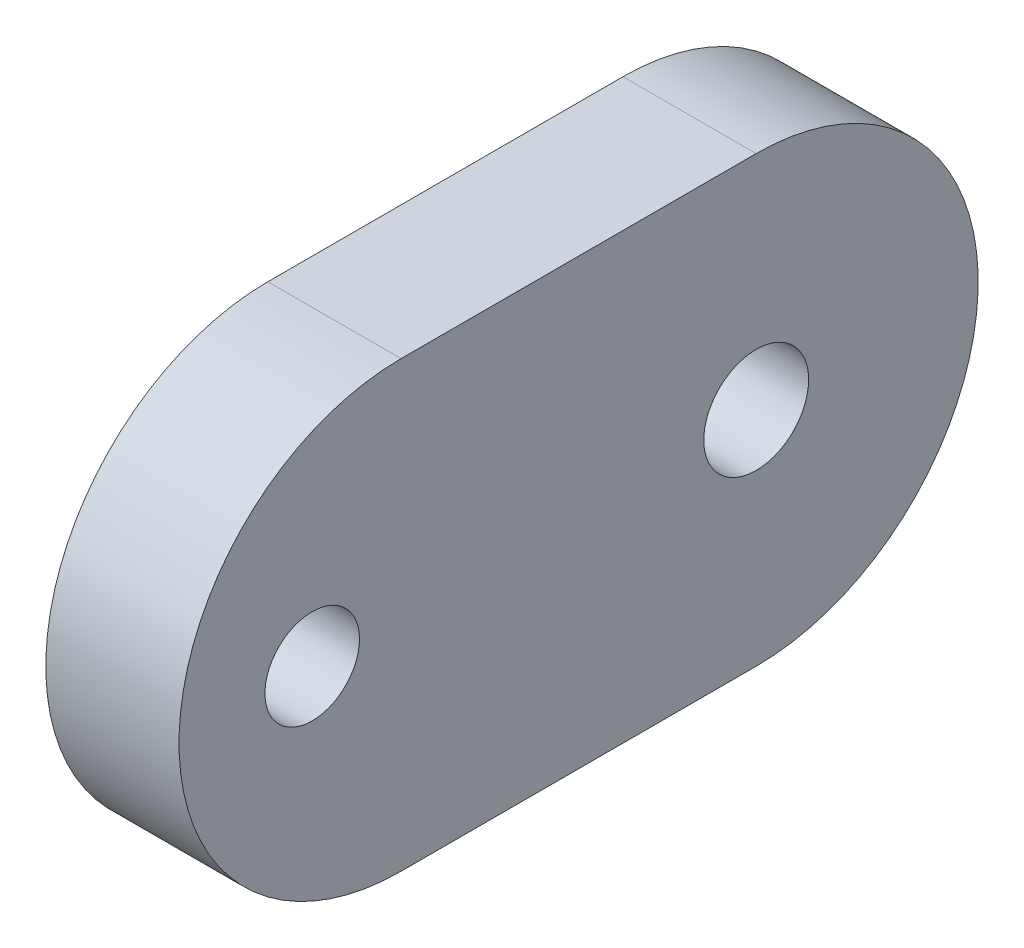
ISO-10303-21;
HEADER;
FILE_DESCRIPTION(('STEP AP214'),'2;1');
FILE_NAME('part.step','',(''),(''),'','','');
FILE_SCHEMA(('AUTOMOTIVE_DESIGN { 1 0 10303 214 1 1 1 1 }'));
ENDSEC;
DATA;
#1=APPLICATION_CONTEXT('core data for automotive mechanical design processes');
#2=APPLICATION_PROTOCOL_DEFINITION('international standard','automotive_design',2000,#1);
#3=PRODUCT_CONTEXT('',#1,'mechanical');
#4=PRODUCT('Part','Part','',(#3));
#5=PRODUCT_RELATED_PRODUCT_CATEGORY('part','',(#4));
#6=PRODUCT_DEFINITION_FORMATION('','',#4);
#7=PRODUCT_DEFINITION_CONTEXT('part definition',#1,'design');
#8=PRODUCT_DEFINITION('design','',#6,#7);
#9=PRODUCT_DEFINITION_SHAPE('','',#8);
#10=(LENGTH_UNIT() NAMED_UNIT(*) SI_UNIT(.MILLI.,.METRE.));
#11=(NAMED_UNIT(*) PLANE_ANGLE_UNIT() SI_UNIT($,.RADIAN.));
#12=(NAMED_UNIT(*) SI_UNIT($,.STERADIAN.) SOLID_ANGLE_UNIT());
#13=UNCERTAINTY_MEASURE_WITH_UNIT(LENGTH_MEASURE(1.E-05),#10,'distance_accuracy_value','');
#14=(GEOMETRIC_REPRESENTATION_CONTEXT(3) GLOBAL_UNCERTAINTY_ASSIGNED_CONTEXT((#13)) GLOBAL_UNIT_ASSIGNED_CONTEXT((#10,
#11,#12)) REPRESENTATION_CONTEXT('',''));
#15=CARTESIAN_POINT('',(0.,0.,0.));
#16=DIRECTION('',(0.,0.,1.));
#17=DIRECTION('',(1.,0.,0.));
#18=AXIS2_PLACEMENT_3D('',#15,#16,#17);
#19=CARTESIAN_POINT('',(3.81,6.35,0.));
#20=DIRECTION('',(-1.,0.,0.));
#21=DIRECTION('',(0.,0.,1.));
#22=AXIS2_PLACEMENT_3D('',#19,#20,#21);
#23=CYLINDRICAL_SURFACE('',#22,6.35);
#24=CARTESIAN_POINT('',(0.,6.35,0.));
#25=DIRECTION('',(1.,0.,0.));
#26=DIRECTION('',(0.,0.,-1.));
#27=AXIS2_PLACEMENT_3D('',#24,#25,#26);
#28=CIRCLE('',#27,6.35);
#29=CARTESIAN_POINT('',(0.,12.7,0.));
#30=VERTEX_POINT('',#29);
#31=CARTESIAN_POINT('',(0.,0.,0.));
#32=VERTEX_POINT('',#31);
#33=EDGE_CURVE('E96',#30,#32,#28,.T.);
#34=ORIENTED_EDGE('',*,*,#33,.T.);
#35=DIRECTION('',(-1.,0.,0.));
#36=VECTOR('',#35,1.);
#37=CARTESIAN_POINT('',(3.81,0.,0.));
#38=LINE('',#37,#36);
#39=CARTESIAN_POINT('',(3.81,0.,0.));
#40=VERTEX_POINT('',#39);
#41=EDGE_CURVE('E11',#40,#32,#38,.T.);
#42=ORIENTED_EDGE('',*,*,#41,.F.);
#43=CARTESIAN_POINT('',(3.81,6.35,0.));
#44=DIRECTION('',(1.,0.,0.));
#45=DIRECTION('',(0.,0.,-1.));
#46=AXIS2_PLACEMENT_3D('',#43,#44,#45);
#47=CIRCLE('',#46,6.35);
#48=CARTESIAN_POINT('',(3.81,12.7,0.));
#49=VERTEX_POINT('',#48);
#50=EDGE_CURVE('E84',#49,#40,#47,.T.);
#51=ORIENTED_EDGE('',*,*,#50,.F.);
#52=DIRECTION('',(-1.,0.,0.));
#53=VECTOR('',#52,1.);
#54=CARTESIAN_POINT('',(3.81,12.7,0.));
#55=LINE('',#54,#53);
#56=EDGE_CURVE('E92',#49,#30,#55,.T.);
#57=ORIENTED_EDGE('',*,*,#56,.T.);
#58=EDGE_LOOP('',(#34,#42,#51,#57));
#59=FACE_BOUND('',#58,.T.);
#60=ADVANCED_FACE('F33',(#59),#23,.T.);
#61=CARTESIAN_POINT('',(3.81,0.,0.));
#62=DIRECTION('',(0.,1.,0.));
#63=DIRECTION('',(0.,0.,1.));
#64=AXIS2_PLACEMENT_3D('',#61,#62,#63);
#65=PLANE('',#64);
#66=DIRECTION('',(0.,0.,-1.));
#67=VECTOR('',#66,1.);
#68=CARTESIAN_POINT('',(0.,0.,0.));
#69=LINE('',#68,#67);
#70=CARTESIAN_POINT('',(0.,0.,-10.16));
#71=VERTEX_POINT('',#70);
#72=EDGE_CURVE('E88',#32,#71,#69,.T.);
#73=ORIENTED_EDGE('',*,*,#72,.T.);
#74=DIRECTION('',(-1.,0.,0.));
#75=VECTOR('',#74,1.);
#76=CARTESIAN_POINT('',(3.81,0.,-10.16));
#77=LINE('',#76,#75);
#78=CARTESIAN_POINT('',(3.81,0.,-10.16));
#79=VERTEX_POINT('',#78);
#80=EDGE_CURVE('E41',#79,#71,#77,.T.);
#81=ORIENTED_EDGE('',*,*,#80,.F.);
#82=DIRECTION('',(0.,0.,-1.));
#83=VECTOR('',#82,1.);
#84=CARTESIAN_POINT('',(3.81,0.,0.));
#85=LINE('',#84,#83);
#86=EDGE_CURVE('E79',#40,#79,#85,.T.);
#87=ORIENTED_EDGE('',*,*,#86,.F.);
#88=ORIENTED_EDGE('',*,*,#41,.T.);
#89=EDGE_LOOP('',(#73,#81,#87,#88));
#90=FACE_BOUND('',#89,.T.);
#91=ADVANCED_FACE('F87',(#90),#65,.F.);
#92=CARTESIAN_POINT('',(3.81,6.35,-10.16));
#93=DIRECTION('',(-1.,0.,0.));
#94=DIRECTION('',(0.,0.,1.));
#95=AXIS2_PLACEMENT_3D('',#92,#93,#94);
#96=CYLINDRICAL_SURFACE('',#95,6.35);
#97=CARTESIAN_POINT('',(0.,6.35,-10.16));
#98=DIRECTION('',(1.,0.,0.));
#99=DIRECTION('',(0.,0.,1.));
#100=AXIS2_PLACEMENT_3D('',#97,#98,#99);
#101=CIRCLE('',#100,6.35);
#102=CARTESIAN_POINT('',(0.,12.7,-10.16));
#103=VERTEX_POINT('',#102);
#104=EDGE_CURVE('E66',#71,#103,#101,.T.);
#105=ORIENTED_EDGE('',*,*,#104,.T.);
#106=DIRECTION('',(-1.,0.,0.));
#107=VECTOR('',#106,1.);
#108=CARTESIAN_POINT('',(3.81,12.7,-10.16));
#109=LINE('',#108,#107);
#110=CARTESIAN_POINT('',(3.81,12.7,-10.16));
#111=VERTEX_POINT('',#110);
#112=EDGE_CURVE('E89',#111,#103,#109,.T.);
#113=ORIENTED_EDGE('',*,*,#112,.F.);
#114=CARTESIAN_POINT('',(3.81,6.35,-10.16));
#115=DIRECTION('',(1.,0.,0.));
#116=DIRECTION('',(0.,0.,1.));
#117=AXIS2_PLACEMENT_3D('',#114,#115,#116);
#118=CIRCLE('',#117,6.35);
#119=EDGE_CURVE('E82',#79,#111,#118,.T.);
#120=ORIENTED_EDGE('',*,*,#119,.F.);
#121=ORIENTED_EDGE('',*,*,#80,.T.);
#122=EDGE_LOOP('',(#105,#113,#120,#121));
#123=FACE_BOUND('',#122,.T.);
#124=ADVANCED_FACE('F90',(#123),#96,.T.);
#125=CARTESIAN_POINT('',(3.81,12.7,0.));
#126=DIRECTION('',(0.,-1.,0.));
#127=DIRECTION('',(0.,0.,-1.));
#128=AXIS2_PLACEMENT_3D('',#125,#126,#127);
#129=PLANE('',#128);
#130=DIRECTION('',(0.,0.,1.));
#131=VECTOR('',#130,1.);
#132=CARTESIAN_POINT('',(0.,12.7,0.));
#133=LINE('',#132,#131);
#134=EDGE_CURVE('E72',#103,#30,#133,.T.);
#135=ORIENTED_EDGE('',*,*,#134,.T.);
#136=ORIENTED_EDGE('',*,*,#56,.F.);
#137=DIRECTION('',(0.,0.,1.));
#138=VECTOR('',#137,1.);
#139=CARTESIAN_POINT('',(3.81,12.7,0.));
#140=LINE('',#139,#138);
#141=EDGE_CURVE('E49',#111,#49,#140,.T.);
#142=ORIENTED_EDGE('',*,*,#141,.F.);
#143=ORIENTED_EDGE('',*,*,#112,.T.);
#144=EDGE_LOOP('',(#135,#136,#142,#143));
#145=FACE_BOUND('',#144,.T.);
#146=ADVANCED_FACE('F104',(#145),#129,.F.);
#147=CARTESIAN_POINT('',(3.81,6.35,0.));
#148=DIRECTION('',(1.,0.,0.));
#149=DIRECTION('',(0.,0.,-1.));
#150=AXIS2_PLACEMENT_3D('',#147,#148,#149);
#151=PLANE('',#150);
#152=CARTESIAN_POINT('',(3.81,6.35,-10.16));
#153=DIRECTION('',(1.,0.,0.));
#154=DIRECTION('',(0.,0.,-1.));
#155=AXIS2_PLACEMENT_3D('',#152,#153,#154);
#156=CIRCLE('',#155,1.5);
#157=CARTESIAN_POINT('',(3.81,6.35,-11.66));
#158=VERTEX_POINT('',#157);
#159=EDGE_CURVE('E118',#158,#158,#156,.T.);
#160=ORIENTED_EDGE('',*,*,#159,.F.);
#161=EDGE_LOOP('',(#160));
#162=FACE_BOUND('',#161,.T.);
#163=CARTESIAN_POINT('',(3.81,6.35,2.54));
#164=DIRECTION('',(1.,0.,0.));
#165=DIRECTION('',(0.,0.,-1.));
#166=AXIS2_PLACEMENT_3D('',#163,#164,#165);
#167=CIRCLE('',#166,1.35255);
#168=CARTESIAN_POINT('',(3.81,6.35,1.18745));
#169=VERTEX_POINT('',#168);
#170=EDGE_CURVE('E112',#169,#169,#167,.T.);
#171=ORIENTED_EDGE('',*,*,#170,.F.);
#172=EDGE_LOOP('',(#171));
#173=FACE_BOUND('',#172,.T.);
#174=ORIENTED_EDGE('',*,*,#50,.T.);
#175=ORIENTED_EDGE('',*,*,#86,.T.);
#176=ORIENTED_EDGE('',*,*,#119,.T.);
#177=ORIENTED_EDGE('',*,*,#141,.T.);
#178=EDGE_LOOP('',(#174,#175,#176,#177));
#179=FACE_BOUND('',#178,.T.);
#180=ADVANCED_FACE('F80',(#162,#173,#179),#151,.T.);
#181=CARTESIAN_POINT('',(0.,6.35,0.));
#182=DIRECTION('',(1.,0.,0.));
#183=DIRECTION('',(0.,0.,-1.));
#184=AXIS2_PLACEMENT_3D('',#181,#182,#183);
#185=PLANE('',#184);
#186=CARTESIAN_POINT('',(0.,6.35,-10.16));
#187=DIRECTION('',(1.,0.,0.));
#188=DIRECTION('',(0.,0.,-1.));
#189=AXIS2_PLACEMENT_3D('',#186,#187,#188);
#190=CIRCLE('',#189,1.5);
#191=CARTESIAN_POINT('',(0.,6.35,-11.66));
#192=VERTEX_POINT('',#191);
#193=EDGE_CURVE('E115',#192,#192,#190,.T.);
#194=ORIENTED_EDGE('',*,*,#193,.T.);
#195=EDGE_LOOP('',(#194));
#196=FACE_BOUND('',#195,.T.);
#197=CARTESIAN_POINT('',(0.,6.35,2.54));
#198=DIRECTION('',(1.,0.,0.));
#199=DIRECTION('',(0.,0.,-1.));
#200=AXIS2_PLACEMENT_3D('',#197,#198,#199);
#201=CIRCLE('',#200,1.35255);
#202=CARTESIAN_POINT('',(0.,6.35,1.18745));
#203=VERTEX_POINT('',#202);
#204=EDGE_CURVE('E99',#203,#203,#201,.T.);
#205=ORIENTED_EDGE('',*,*,#204,.T.);
#206=EDGE_LOOP('',(#205));
#207=FACE_BOUND('',#206,.T.);
#208=ORIENTED_EDGE('',*,*,#33,.F.);
#209=ORIENTED_EDGE('',*,*,#134,.F.);
#210=ORIENTED_EDGE('',*,*,#104,.F.);
#211=ORIENTED_EDGE('',*,*,#72,.F.);
#212=EDGE_LOOP('',(#208,#209,#210,#211));
#213=FACE_BOUND('',#212,.T.);
#214=ADVANCED_FACE('F107',(#196,#207,#213),#185,.F.);
#215=CARTESIAN_POINT('',(3.81,6.35,2.54));
#216=DIRECTION('',(1.,0.,0.));
#217=DIRECTION('',(0.,0.,-1.));
#218=AXIS2_PLACEMENT_3D('',#215,#216,#217);
#219=CYLINDRICAL_SURFACE('',#218,1.35255);
#220=ORIENTED_EDGE('',*,*,#204,.F.);
#221=EDGE_LOOP('',(#220));
#222=FACE_BOUND('',#221,.T.);
#223=ORIENTED_EDGE('',*,*,#170,.T.);
#224=EDGE_LOOP('',(#223));
#225=FACE_BOUND('',#224,.T.);
#226=ADVANCED_FACE('F129',(#222,#225),#219,.F.);
#227=CARTESIAN_POINT('',(3.81,6.35,-10.16));
#228=DIRECTION('',(1.,0.,0.));
#229=DIRECTION('',(0.,0.,-1.));
#230=AXIS2_PLACEMENT_3D('',#227,#228,#229);
#231=CYLINDRICAL_SURFACE('',#230,1.5);
#232=ORIENTED_EDGE('',*,*,#193,.F.);
#233=EDGE_LOOP('',(#232));
#234=FACE_BOUND('',#233,.T.);
#235=ORIENTED_EDGE('',*,*,#159,.T.);
#236=EDGE_LOOP('',(#235));
#237=FACE_BOUND('',#236,.T.);
#238=ADVANCED_FACE('F122',(#234,#237),#231,.F.);
#239=CLOSED_SHELL('',(#60,#91,#124,#146,#180,#214,#226,#238));
#240=MANIFOLD_SOLID_BREP('B2',#239);
#241=ADVANCED_BREP_SHAPE_REPRESENTATION('',(#18,#240),#14);
#242=SHAPE_DEFINITION_REPRESENTATION(#9,#241);
ENDSEC;
END-ISO-10303-21;
